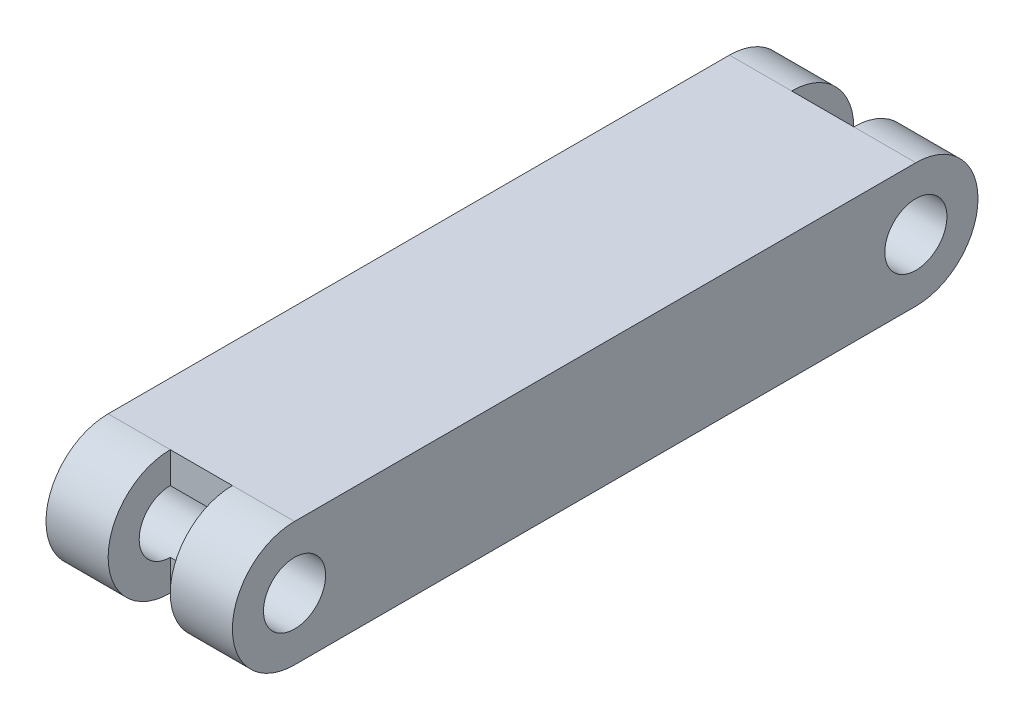
ISO-10303-21;
HEADER;
FILE_DESCRIPTION(('STEP AP214'),'2;1');
FILE_NAME('part.step','',(''),(''),'','','');
FILE_SCHEMA(('AUTOMOTIVE_DESIGN { 1 0 10303 214 1 1 1 1 }'));
ENDSEC;
DATA;
#1=APPLICATION_CONTEXT('core data for automotive mechanical design processes');
#2=APPLICATION_PROTOCOL_DEFINITION('international standard','automotive_design',2000,#1);
#3=PRODUCT_CONTEXT('',#1,'mechanical');
#4=PRODUCT('Part','Part','',(#3));
#5=PRODUCT_RELATED_PRODUCT_CATEGORY('part','',(#4));
#6=PRODUCT_DEFINITION_FORMATION('','',#4);
#7=PRODUCT_DEFINITION_CONTEXT('part definition',#1,'design');
#8=PRODUCT_DEFINITION('design','',#6,#7);
#9=PRODUCT_DEFINITION_SHAPE('','',#8);
#10=(LENGTH_UNIT() NAMED_UNIT(*) SI_UNIT(.MILLI.,.METRE.));
#11=(NAMED_UNIT(*) PLANE_ANGLE_UNIT() SI_UNIT($,.RADIAN.));
#12=(NAMED_UNIT(*) SI_UNIT($,.STERADIAN.) SOLID_ANGLE_UNIT());
#13=UNCERTAINTY_MEASURE_WITH_UNIT(LENGTH_MEASURE(1.E-05),#10,'distance_accuracy_value','');
#14=(GEOMETRIC_REPRESENTATION_CONTEXT(3) GLOBAL_UNCERTAINTY_ASSIGNED_CONTEXT((#13)) GLOBAL_UNIT_ASSIGNED_CONTEXT((#10,
#11,#12)) REPRESENTATION_CONTEXT('',''));
#15=CARTESIAN_POINT('',(0.,0.,0.));
#16=DIRECTION('',(0.,0.,1.));
#17=DIRECTION('',(1.,0.,0.));
#18=AXIS2_PLACEMENT_3D('',#15,#16,#17);
#19=CARTESIAN_POINT('',(50.,5.,0.));
#20=DIRECTION('',(-1.,0.,0.));
#21=DIRECTION('',(0.,0.,1.));
#22=AXIS2_PLACEMENT_3D('',#19,#20,#21);
#23=CYLINDRICAL_SURFACE('',#22,10.);
#24=CARTESIAN_POINT('',(50.,5.,0.));
#25=DIRECTION('',(-1.,0.,0.));
#26=DIRECTION('',(0.,0.,1.));
#27=AXIS2_PLACEMENT_3D('',#24,#25,#26);
#28=CIRCLE('',#27,10.);
#29=CARTESIAN_POINT('',(50.,5.,10.));
#30=VERTEX_POINT('',#29);
#31=EDGE_CURVE('E202',#30,#30,#28,.T.);
#32=ORIENTED_EDGE('',*,*,#31,.F.);
#33=EDGE_LOOP('',(#32));
#34=FACE_BOUND('',#33,.T.);
#35=CARTESIAN_POINT('',(30.,5.,0.));
#36=DIRECTION('',(1.,0.,0.));
#37=DIRECTION('',(0.,0.,-1.));
#38=AXIS2_PLACEMENT_3D('',#35,#36,#37);
#39=CIRCLE('',#38,10.);
#40=CARTESIAN_POINT('',(30.,5.,-10.));
#41=VERTEX_POINT('',#40);
#42=EDGE_CURVE('E205',#41,#41,#39,.T.);
#43=ORIENTED_EDGE('',*,*,#42,.F.);
#44=EDGE_LOOP('',(#43));
#45=FACE_BOUND('',#44,.T.);
#46=ADVANCED_FACE('F38',(#34,#45),#23,.F.);
#47=CARTESIAN_POINT('',(0.,0.,200.));
#48=DIRECTION('',(0.,0.,1.));
#49=DIRECTION('',(1.,0.,0.));
#50=AXIS2_PLACEMENT_3D('',#47,#48,#49);
#51=PLANE('',#50);
#52=DIRECTION('',(0.,-1.,0.));
#53=VECTOR('',#52,1.);
#54=CARTESIAN_POINT('',(10.,0.,200.));
#55=LINE('',#54,#53);
#56=CARTESIAN_POINT('',(10.,25.,200.));
#57=VERTEX_POINT('',#56);
#58=CARTESIAN_POINT('',(10.,15.,200.));
#59=VERTEX_POINT('',#58);
#60=EDGE_CURVE('E207',#57,#59,#55,.T.);
#61=ORIENTED_EDGE('',*,*,#60,.T.);
#62=DIRECTION('',(-1.,0.,0.));
#63=VECTOR('',#62,1.);
#64=CARTESIAN_POINT('',(50.,15.,200.));
#65=LINE('',#64,#63);
#66=CARTESIAN_POINT('',(30.,15.,200.));
#67=VERTEX_POINT('',#66);
#68=EDGE_CURVE('E52',#59,#67,#65,.F.);
#69=ORIENTED_EDGE('',*,*,#68,.T.);
#70=DIRECTION('',(0.,1.,0.));
#71=VECTOR('',#70,1.);
#72=CARTESIAN_POINT('',(30.,0.,200.));
#73=LINE('',#72,#71);
#74=CARTESIAN_POINT('',(30.,25.,200.));
#75=VERTEX_POINT('',#74);
#76=EDGE_CURVE('E179',#67,#75,#73,.T.);
#77=ORIENTED_EDGE('',*,*,#76,.T.);
#78=DIRECTION('',(-1.,0.,0.));
#79=VECTOR('',#78,1.);
#80=CARTESIAN_POINT('',(50.,25.,200.));
#81=LINE('',#80,#79);
#82=EDGE_CURVE('E188',#75,#57,#81,.T.);
#83=ORIENTED_EDGE('',*,*,#82,.T.);
#84=EDGE_LOOP('',(#61,#69,#77,#83));
#85=FACE_BOUND('',#84,.T.);
#86=ADVANCED_FACE('F187',(#85),#51,.T.);
#87=CARTESIAN_POINT('',(30.,-15.,200.));
#88=VERTEX_POINT('',#87);
#89=CARTESIAN_POINT('',(30.,-5.,200.));
#90=VERTEX_POINT('',#89);
#91=EDGE_CURVE('E46',#88,#90,#73,.T.);
#92=ORIENTED_EDGE('',*,*,#91,.T.);
#93=DIRECTION('',(-1.,0.,0.));
#94=VECTOR('',#93,1.);
#95=CARTESIAN_POINT('',(50.,-5.,200.));
#96=LINE('',#95,#94);
#97=CARTESIAN_POINT('',(10.,-5.,200.));
#98=VERTEX_POINT('',#97);
#99=EDGE_CURVE('E244',#90,#98,#96,.T.);
#100=ORIENTED_EDGE('',*,*,#99,.T.);
#101=CARTESIAN_POINT('',(10.,-15.,200.));
#102=VERTEX_POINT('',#101);
#103=EDGE_CURVE('E60',#98,#102,#55,.T.);
#104=ORIENTED_EDGE('',*,*,#103,.T.);
#105=DIRECTION('',(1.,0.,0.));
#106=VECTOR('',#105,1.);
#107=CARTESIAN_POINT('',(50.,-15.,200.));
#108=LINE('',#107,#106);
#109=EDGE_CURVE('E149',#102,#88,#108,.T.);
#110=ORIENTED_EDGE('',*,*,#109,.T.);
#111=EDGE_LOOP('',(#92,#100,#104,#110));
#112=FACE_BOUND('',#111,.T.);
#113=ADVANCED_FACE('F228',(#112),#51,.T.);
#114=CARTESIAN_POINT('',(-10.,-15.,200.));
#115=DIRECTION('',(1.,0.,0.));
#116=DIRECTION('',(0.,0.,-1.));
#117=AXIS2_PLACEMENT_3D('',#114,#115,#116);
#118=PLANE('',#117);
#119=CARTESIAN_POINT('',(-10.,5.,200.));
#120=DIRECTION('',(1.,0.,0.));
#121=DIRECTION('',(0.,0.,-1.));
#122=AXIS2_PLACEMENT_3D('',#119,#120,#121);
#123=CIRCLE('',#122,10.);
#124=CARTESIAN_POINT('',(-10.,5.,190.));
#125=VERTEX_POINT('',#124);
#126=EDGE_CURVE('E236',#125,#125,#123,.F.);
#127=ORIENTED_EDGE('',*,*,#126,.F.);
#128=EDGE_LOOP('',(#127));
#129=FACE_BOUND('',#128,.T.);
#130=DIRECTION('',(0.,0.,-1.));
#131=VECTOR('',#130,1.);
#132=CARTESIAN_POINT('',(-10.,-15.,200.));
#133=LINE('',#132,#131);
#134=CARTESIAN_POINT('',(-10.,-15.,200.));
#135=VERTEX_POINT('',#134);
#136=CARTESIAN_POINT('',(-10.,-15.,0.));
#137=VERTEX_POINT('',#136);
#138=EDGE_CURVE('E171',#135,#137,#133,.T.);
#139=ORIENTED_EDGE('',*,*,#138,.F.);
#140=CARTESIAN_POINT('',(-10.,5.,200.));
#141=DIRECTION('',(1.,0.,0.));
#142=DIRECTION('',(0.,0.,-1.));
#143=AXIS2_PLACEMENT_3D('',#140,#141,#142);
#144=CIRCLE('',#143,20.);
#145=CARTESIAN_POINT('',(-10.,25.,200.));
#146=VERTEX_POINT('',#145);
#147=EDGE_CURVE('E233',#146,#135,#144,.T.);
#148=ORIENTED_EDGE('',*,*,#147,.F.);
#149=DIRECTION('',(0.,0.,-1.));
#150=VECTOR('',#149,1.);
#151=CARTESIAN_POINT('',(-10.,25.,200.));
#152=LINE('',#151,#150);
#153=CARTESIAN_POINT('',(-10.,25.,0.));
#154=VERTEX_POINT('',#153);
#155=EDGE_CURVE('E175',#146,#154,#152,.T.);
#156=ORIENTED_EDGE('',*,*,#155,.T.);
#157=CARTESIAN_POINT('',(-10.,5.,0.));
#158=DIRECTION('',(-1.,0.,0.));
#159=DIRECTION('',(0.,0.,1.));
#160=AXIS2_PLACEMENT_3D('',#157,#158,#159);
#161=CIRCLE('',#160,20.);
#162=EDGE_CURVE('E217',#154,#137,#161,.T.);
#163=ORIENTED_EDGE('',*,*,#162,.T.);
#164=EDGE_LOOP('',(#139,#148,#156,#163));
#165=FACE_BOUND('',#164,.T.);
#166=CARTESIAN_POINT('',(-10.,5.,0.));
#167=DIRECTION('',(1.,0.,0.));
#168=DIRECTION('',(0.,0.,-1.));
#169=AXIS2_PLACEMENT_3D('',#166,#167,#168);
#170=CIRCLE('',#169,10.);
#171=CARTESIAN_POINT('',(-10.,5.,-10.));
#172=VERTEX_POINT('',#171);
#173=EDGE_CURVE('E214',#172,#172,#170,.T.);
#174=ORIENTED_EDGE('',*,*,#173,.T.);
#175=EDGE_LOOP('',(#174));
#176=FACE_BOUND('',#175,.T.);
#177=ADVANCED_FACE('F40',(#129,#165,#176),#118,.F.);
#178=CARTESIAN_POINT('',(50.,-15.,200.));
#179=DIRECTION('',(0.,1.,0.));
#180=DIRECTION('',(-1.,0.,0.));
#181=AXIS2_PLACEMENT_3D('',#178,#179,#180);
#182=PLANE('',#181);
#183=DIRECTION('',(1.,0.,0.));
#184=VECTOR('',#183,1.);
#185=CARTESIAN_POINT('',(50.,-15.,0.));
#186=LINE('',#185,#184);
#187=CARTESIAN_POINT('',(9.99999999999999,-15.,0.));
#188=VERTEX_POINT('',#187);
#189=EDGE_CURVE('E154',#137,#188,#186,.T.);
#190=ORIENTED_EDGE('',*,*,#189,.T.);
#191=CARTESIAN_POINT('',(30.,-15.,0.));
#192=VERTEX_POINT('',#191);
#193=EDGE_CURVE('E157',#188,#192,#186,.T.);
#194=ORIENTED_EDGE('',*,*,#193,.T.);
#195=CARTESIAN_POINT('',(50.,-15.,0.));
#196=VERTEX_POINT('',#195);
#197=EDGE_CURVE('E141',#192,#196,#186,.T.);
#198=ORIENTED_EDGE('',*,*,#197,.T.);
#199=DIRECTION('',(0.,0.,-1.));
#200=VECTOR('',#199,1.);
#201=CARTESIAN_POINT('',(50.,-15.,200.));
#202=LINE('',#201,#200);
#203=CARTESIAN_POINT('',(50.,-15.,200.));
#204=VERTEX_POINT('',#203);
#205=EDGE_CURVE('E164',#204,#196,#202,.T.);
#206=ORIENTED_EDGE('',*,*,#205,.F.);
#207=EDGE_CURVE('E147',#88,#204,#108,.T.);
#208=ORIENTED_EDGE('',*,*,#207,.F.);
#209=ORIENTED_EDGE('',*,*,#109,.F.);
#210=EDGE_CURVE('E151',#135,#102,#108,.T.);
#211=ORIENTED_EDGE('',*,*,#210,.F.);
#212=ORIENTED_EDGE('',*,*,#138,.T.);
#213=EDGE_LOOP('',(#190,#194,#198,#206,#208,#209,#211,#212));
#214=FACE_BOUND('',#213,.T.);
#215=ADVANCED_FACE('F162',(#214),#182,.F.);
#216=CARTESIAN_POINT('',(50.,-15.,200.));
#217=DIRECTION('',(-1.,0.,0.));
#218=DIRECTION('',(0.,0.,1.));
#219=AXIS2_PLACEMENT_3D('',#216,#217,#218);
#220=PLANE('',#219);
#221=CARTESIAN_POINT('',(50.,5.,200.));
#222=DIRECTION('',(1.,0.,0.));
#223=DIRECTION('',(0.,0.,-1.));
#224=AXIS2_PLACEMENT_3D('',#221,#222,#223);
#225=CIRCLE('',#224,10.);
#226=CARTESIAN_POINT('',(50.,5.,190.));
#227=VERTEX_POINT('',#226);
#228=EDGE_CURVE('E246',#227,#227,#225,.T.);
#229=ORIENTED_EDGE('',*,*,#228,.F.);
#230=EDGE_LOOP('',(#229));
#231=FACE_BOUND('',#230,.T.);
#232=DIRECTION('',(0.,0.,-1.));
#233=VECTOR('',#232,1.);
#234=CARTESIAN_POINT('',(50.,25.,200.));
#235=LINE('',#234,#233);
#236=CARTESIAN_POINT('',(50.,25.,200.));
#237=VERTEX_POINT('',#236);
#238=CARTESIAN_POINT('',(50.,25.,0.));
#239=VERTEX_POINT('',#238);
#240=EDGE_CURVE('E146',#237,#239,#235,.T.);
#241=ORIENTED_EDGE('',*,*,#240,.F.);
#242=CARTESIAN_POINT('',(50.,5.00000000000001,200.));
#243=DIRECTION('',(-1.,0.,0.));
#244=DIRECTION('',(0.,0.,1.));
#245=AXIS2_PLACEMENT_3D('',#242,#243,#244);
#246=CIRCLE('',#245,20.);
#247=EDGE_CURVE('E170',#204,#237,#246,.T.);
#248=ORIENTED_EDGE('',*,*,#247,.F.);
#249=ORIENTED_EDGE('',*,*,#205,.T.);
#250=CARTESIAN_POINT('',(50.,5.00000000000001,0.));
#251=DIRECTION('',(1.,0.,0.));
#252=DIRECTION('',(0.,0.,-1.));
#253=AXIS2_PLACEMENT_3D('',#250,#251,#252);
#254=CIRCLE('',#253,20.);
#255=EDGE_CURVE('E142',#196,#239,#254,.T.);
#256=ORIENTED_EDGE('',*,*,#255,.T.);
#257=EDGE_LOOP('',(#241,#248,#249,#256));
#258=FACE_BOUND('',#257,.T.);
#259=ORIENTED_EDGE('',*,*,#31,.T.);
#260=EDGE_LOOP('',(#259));
#261=FACE_BOUND('',#260,.T.);
#262=ADVANCED_FACE('F167',(#231,#258,#261),#220,.F.);
#263=CARTESIAN_POINT('',(50.,25.,200.));
#264=DIRECTION('',(0.,-1.,0.));
#265=DIRECTION('',(1.,0.,0.));
#266=AXIS2_PLACEMENT_3D('',#263,#264,#265);
#267=PLANE('',#266);
#268=DIRECTION('',(-1.,0.,0.));
#269=VECTOR('',#268,1.);
#270=CARTESIAN_POINT('',(50.,25.,0.));
#271=LINE('',#270,#269);
#272=CARTESIAN_POINT('',(30.,25.,0.));
#273=VERTEX_POINT('',#272);
#274=EDGE_CURVE('E125',#239,#273,#271,.T.);
#275=ORIENTED_EDGE('',*,*,#274,.T.);
#276=CARTESIAN_POINT('',(9.99999999999999,25.,0.));
#277=VERTEX_POINT('',#276);
#278=EDGE_CURVE('E114',#273,#277,#271,.T.);
#279=ORIENTED_EDGE('',*,*,#278,.T.);
#280=EDGE_CURVE('E126',#277,#154,#271,.T.);
#281=ORIENTED_EDGE('',*,*,#280,.T.);
#282=ORIENTED_EDGE('',*,*,#155,.F.);
#283=EDGE_CURVE('E196',#57,#146,#81,.T.);
#284=ORIENTED_EDGE('',*,*,#283,.F.);
#285=ORIENTED_EDGE('',*,*,#82,.F.);
#286=EDGE_CURVE('E194',#237,#75,#81,.T.);
#287=ORIENTED_EDGE('',*,*,#286,.F.);
#288=ORIENTED_EDGE('',*,*,#240,.T.);
#289=EDGE_LOOP('',(#275,#279,#281,#282,#284,#285,#287,#288));
#290=FACE_BOUND('',#289,.T.);
#291=ADVANCED_FACE('F144',(#290),#267,.F.);
#292=CARTESIAN_POINT('',(30.,5.00000000000001,0.));
#293=DIRECTION('',(1.,0.,0.));
#294=DIRECTION('',(0.,0.,-1.));
#295=AXIS2_PLACEMENT_3D('',#292,#293,#294);
#296=CYLINDRICAL_SURFACE('',#295,20.);
#297=ORIENTED_EDGE('',*,*,#197,.F.);
#298=CARTESIAN_POINT('',(30.,5.00000000000001,0.));
#299=DIRECTION('',(1.,0.,0.));
#300=DIRECTION('',(0.,0.,-1.));
#301=AXIS2_PLACEMENT_3D('',#298,#299,#300);
#302=CIRCLE('',#301,20.);
#303=EDGE_CURVE('E133',#192,#273,#302,.T.);
#304=ORIENTED_EDGE('',*,*,#303,.T.);
#305=ORIENTED_EDGE('',*,*,#274,.F.);
#306=ORIENTED_EDGE('',*,*,#255,.F.);
#307=EDGE_LOOP('',(#297,#304,#305,#306));
#308=FACE_BOUND('',#307,.T.);
#309=ADVANCED_FACE('F138',(#308),#296,.T.);
#310=CARTESIAN_POINT('',(30.,5.00000000000001,0.));
#311=DIRECTION('',(1.,0.,0.));
#312=DIRECTION('',(0.,0.,-1.));
#313=AXIS2_PLACEMENT_3D('',#310,#311,#312);
#314=PLANE('',#313);
#315=CARTESIAN_POINT('',(30.,5.,0.));
#316=DIRECTION('',(-1.,0.,0.));
#317=DIRECTION('',(0.,0.,1.));
#318=AXIS2_PLACEMENT_3D('',#315,#316,#317);
#319=CIRCLE('',#318,20.);
#320=EDGE_CURVE('E117',#192,#273,#319,.T.);
#321=ORIENTED_EDGE('',*,*,#320,.T.);
#322=ORIENTED_EDGE('',*,*,#303,.F.);
#323=EDGE_LOOP('',(#321,#322));
#324=FACE_BOUND('',#323,.T.);
#325=ORIENTED_EDGE('',*,*,#42,.T.);
#326=EDGE_LOOP('',(#325));
#327=FACE_BOUND('',#326,.T.);
#328=ADVANCED_FACE('F131',(#324,#327),#314,.F.);
#329=CARTESIAN_POINT('',(10.,5.,0.));
#330=DIRECTION('',(-1.,0.,0.));
#331=DIRECTION('',(0.,0.,1.));
#332=AXIS2_PLACEMENT_3D('',#329,#330,#331);
#333=PLANE('',#332);
#334=CARTESIAN_POINT('',(10.,5.,0.));
#335=DIRECTION('',(-1.,0.,0.));
#336=DIRECTION('',(0.,0.,1.));
#337=AXIS2_PLACEMENT_3D('',#334,#335,#336);
#338=CIRCLE('',#337,10.);
#339=CARTESIAN_POINT('',(10.,5.,10.));
#340=VERTEX_POINT('',#339);
#341=EDGE_CURVE('E173',#340,#340,#338,.T.);
#342=ORIENTED_EDGE('',*,*,#341,.T.);
#343=EDGE_LOOP('',(#342));
#344=FACE_BOUND('',#343,.T.);
#345=CARTESIAN_POINT('',(10.,5.,0.));
#346=DIRECTION('',(-1.,0.,0.));
#347=DIRECTION('',(0.,0.,1.));
#348=AXIS2_PLACEMENT_3D('',#345,#346,#347);
#349=CIRCLE('',#348,20.);
#350=EDGE_CURVE('E218',#277,#188,#349,.T.);
#351=ORIENTED_EDGE('',*,*,#350,.F.);
#352=CARTESIAN_POINT('',(9.99999999999999,5.,0.));
#353=DIRECTION('',(-1.,0.,0.));
#354=DIRECTION('',(0.,0.,1.));
#355=AXIS2_PLACEMENT_3D('',#352,#353,#354);
#356=CIRCLE('',#355,20.);
#357=EDGE_CURVE('E120',#188,#277,#356,.T.);
#358=ORIENTED_EDGE('',*,*,#357,.F.);
#359=EDGE_LOOP('',(#351,#358));
#360=FACE_BOUND('',#359,.T.);
#361=ADVANCED_FACE('F284',(#344,#360),#333,.F.);
#362=CARTESIAN_POINT('',(10.,5.,0.));
#363=DIRECTION('',(-1.,0.,0.));
#364=DIRECTION('',(0.,0.,1.));
#365=AXIS2_PLACEMENT_3D('',#362,#363,#364);
#366=CYLINDRICAL_SURFACE('',#365,20.);
#367=ORIENTED_EDGE('',*,*,#350,.T.);
#368=ORIENTED_EDGE('',*,*,#189,.F.);
#369=ORIENTED_EDGE('',*,*,#162,.F.);
#370=ORIENTED_EDGE('',*,*,#280,.F.);
#371=EDGE_LOOP('',(#367,#368,#369,#370));
#372=FACE_BOUND('',#371,.T.);
#373=ADVANCED_FACE('F277',(#372),#366,.T.);
#374=ORIENTED_EDGE('',*,*,#341,.F.);
#375=EDGE_LOOP('',(#374));
#376=FACE_BOUND('',#375,.T.);
#377=ORIENTED_EDGE('',*,*,#173,.F.);
#378=EDGE_LOOP('',(#377));
#379=FACE_BOUND('',#378,.T.);
#380=ADVANCED_FACE('F266',(#376,#379),#23,.F.);
#381=CARTESIAN_POINT('',(30.,5.00000000000001,200.));
#382=DIRECTION('',(1.,0.,0.));
#383=DIRECTION('',(0.,0.,-1.));
#384=AXIS2_PLACEMENT_3D('',#381,#382,#383);
#385=CYLINDRICAL_SURFACE('',#384,20.);
#386=ORIENTED_EDGE('',*,*,#207,.T.);
#387=ORIENTED_EDGE('',*,*,#247,.T.);
#388=ORIENTED_EDGE('',*,*,#286,.T.);
#389=CARTESIAN_POINT('',(30.,5.00000000000001,200.));
#390=DIRECTION('',(-1.,0.,0.));
#391=DIRECTION('',(0.,0.,1.));
#392=AXIS2_PLACEMENT_3D('',#389,#390,#391);
#393=CIRCLE('',#392,20.);
#394=EDGE_CURVE('E200',#88,#75,#393,.T.);
#395=ORIENTED_EDGE('',*,*,#394,.F.);
#396=EDGE_LOOP('',(#386,#387,#388,#395));
#397=FACE_BOUND('',#396,.T.);
#398=ADVANCED_FACE('F199',(#397),#385,.T.);
#399=CARTESIAN_POINT('',(30.,5.00000000000001,200.));
#400=DIRECTION('',(1.,0.,0.));
#401=DIRECTION('',(0.,0.,1.));
#402=AXIS2_PLACEMENT_3D('',#399,#400,#401);
#403=PLANE('',#402);
#404=CARTESIAN_POINT('',(30.,5.,200.));
#405=DIRECTION('',(1.,0.,0.));
#406=DIRECTION('',(0.,0.,-1.));
#407=AXIS2_PLACEMENT_3D('',#404,#405,#406);
#408=CIRCLE('',#407,10.);
#409=EDGE_CURVE('E239',#90,#67,#408,.F.);
#410=ORIENTED_EDGE('',*,*,#409,.F.);
#411=ORIENTED_EDGE('',*,*,#91,.F.);
#412=ORIENTED_EDGE('',*,*,#394,.T.);
#413=ORIENTED_EDGE('',*,*,#76,.F.);
#414=EDGE_LOOP('',(#410,#411,#412,#413));
#415=FACE_BOUND('',#414,.T.);
#416=ADVANCED_FACE('F201',(#415),#403,.F.);
#417=CARTESIAN_POINT('',(10.,5.,200.));
#418=DIRECTION('',(-1.,0.,0.));
#419=DIRECTION('',(0.,0.,1.));
#420=AXIS2_PLACEMENT_3D('',#417,#418,#419);
#421=CYLINDRICAL_SURFACE('',#420,20.);
#422=ORIENTED_EDGE('',*,*,#147,.T.);
#423=ORIENTED_EDGE('',*,*,#210,.T.);
#424=CARTESIAN_POINT('',(10.,5.,200.));
#425=DIRECTION('',(1.,0.,0.));
#426=DIRECTION('',(0.,0.,-1.));
#427=AXIS2_PLACEMENT_3D('',#424,#425,#426);
#428=CIRCLE('',#427,20.);
#429=EDGE_CURVE('E235',#57,#102,#428,.T.);
#430=ORIENTED_EDGE('',*,*,#429,.F.);
#431=ORIENTED_EDGE('',*,*,#283,.T.);
#432=EDGE_LOOP('',(#422,#423,#430,#431));
#433=FACE_BOUND('',#432,.T.);
#434=ADVANCED_FACE('F234',(#433),#421,.T.);
#435=CARTESIAN_POINT('',(10.,5.,200.));
#436=DIRECTION('',(-1.,0.,0.));
#437=DIRECTION('',(0.,0.,-1.));
#438=AXIS2_PLACEMENT_3D('',#435,#436,#437);
#439=PLANE('',#438);
#440=CARTESIAN_POINT('',(10.,5.,200.));
#441=DIRECTION('',(-1.,0.,0.));
#442=DIRECTION('',(0.,0.,1.));
#443=AXIS2_PLACEMENT_3D('',#440,#441,#442);
#444=CIRCLE('',#443,10.);
#445=EDGE_CURVE('E11',#59,#98,#444,.F.);
#446=ORIENTED_EDGE('',*,*,#445,.F.);
#447=ORIENTED_EDGE('',*,*,#60,.F.);
#448=ORIENTED_EDGE('',*,*,#429,.T.);
#449=ORIENTED_EDGE('',*,*,#103,.F.);
#450=EDGE_LOOP('',(#446,#447,#448,#449));
#451=FACE_BOUND('',#450,.T.);
#452=ADVANCED_FACE('F297',(#451),#439,.F.);
#453=CARTESIAN_POINT('',(50.,5.,200.));
#454=DIRECTION('',(-1.,0.,0.));
#455=DIRECTION('',(0.,0.,1.));
#456=AXIS2_PLACEMENT_3D('',#453,#454,#455);
#457=CYLINDRICAL_SURFACE('',#456,10.);
#458=ORIENTED_EDGE('',*,*,#409,.T.);
#459=ORIENTED_EDGE('',*,*,#68,.F.);
#460=ORIENTED_EDGE('',*,*,#445,.T.);
#461=ORIENTED_EDGE('',*,*,#99,.F.);
#462=EDGE_LOOP('',(#458,#459,#460,#461));
#463=FACE_BOUND('',#462,.T.);
#464=ORIENTED_EDGE('',*,*,#228,.T.);
#465=EDGE_LOOP('',(#464));
#466=FACE_BOUND('',#465,.T.);
#467=ORIENTED_EDGE('',*,*,#126,.T.);
#468=EDGE_LOOP('',(#467));
#469=FACE_BOUND('',#468,.T.);
#470=ADVANCED_FACE('F251',(#463,#466,#469),#457,.F.);
#471=CARTESIAN_POINT('',(9.99999999999999,5.,0.));
#472=DIRECTION('',(1.,0.,0.));
#473=DIRECTION('',(0.,0.,-1.));
#474=AXIS2_PLACEMENT_3D('',#471,#472,#473);
#475=CYLINDRICAL_SURFACE('',#474,20.);
#476=ORIENTED_EDGE('',*,*,#193,.F.);
#477=ORIENTED_EDGE('',*,*,#357,.T.);
#478=ORIENTED_EDGE('',*,*,#278,.F.);
#479=ORIENTED_EDGE('',*,*,#320,.F.);
#480=EDGE_LOOP('',(#476,#477,#478,#479));
#481=FACE_BOUND('',#480,.T.);
#482=ADVANCED_FACE('F116',(#481),#475,.F.);
#483=CLOSED_SHELL('',(#46,#86,#113,#177,#215,#262,#291,#309,#328,#361,#373,#380,#398,#416,#434,
#452,#470,#482));
#484=MANIFOLD_SOLID_BREP('B2',#483);
#485=ADVANCED_BREP_SHAPE_REPRESENTATION('',(#18,#484),#14);
#486=SHAPE_DEFINITION_REPRESENTATION(#9,#485);
ENDSEC;
END-ISO-10303-21;
